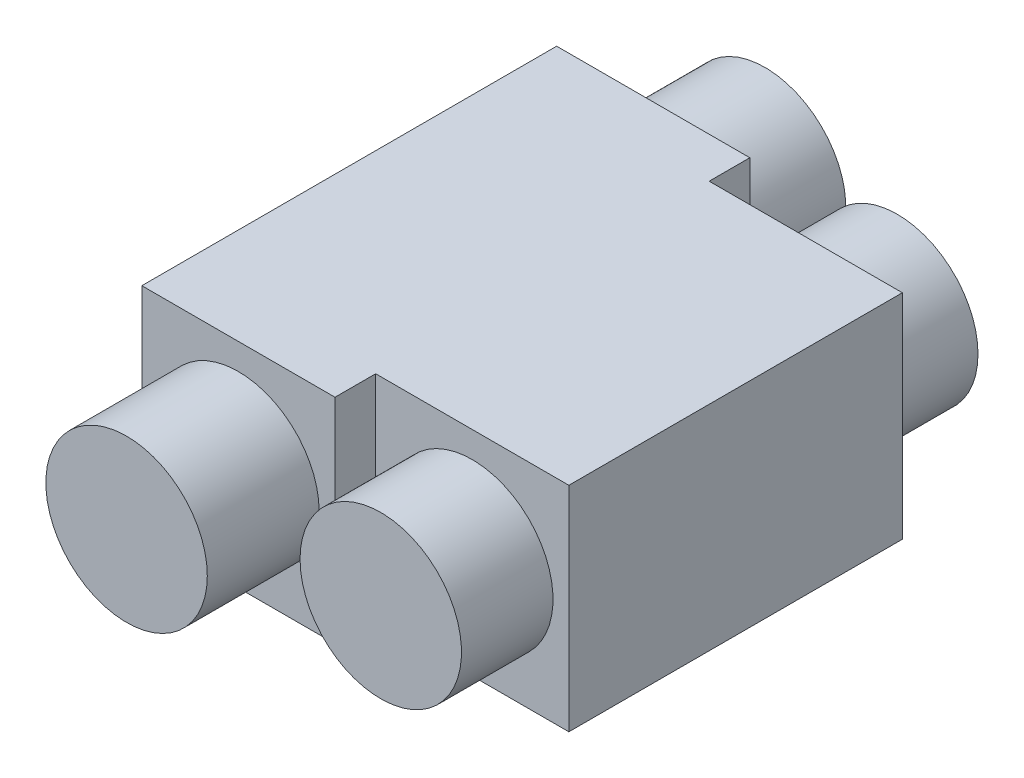
ISO-10303-21;
HEADER;
FILE_DESCRIPTION(('STEP AP214'),'2;1');
FILE_NAME('part.step','',(''),(''),'','','');
FILE_SCHEMA(('AUTOMOTIVE_DESIGN { 1 0 10303 214 1 1 1 1 }'));
ENDSEC;
DATA;
#1=APPLICATION_CONTEXT('core data for automotive mechanical design processes');
#2=APPLICATION_PROTOCOL_DEFINITION('international standard','automotive_design',2000,#1);
#3=PRODUCT_CONTEXT('',#1,'mechanical');
#4=PRODUCT('Part','Part','',(#3));
#5=PRODUCT_RELATED_PRODUCT_CATEGORY('part','',(#4));
#6=PRODUCT_DEFINITION_FORMATION('','',#4);
#7=PRODUCT_DEFINITION_CONTEXT('part definition',#1,'design');
#8=PRODUCT_DEFINITION('design','',#6,#7);
#9=PRODUCT_DEFINITION_SHAPE('','',#8);
#10=(LENGTH_UNIT() NAMED_UNIT(*) SI_UNIT(.MILLI.,.METRE.));
#11=(NAMED_UNIT(*) PLANE_ANGLE_UNIT() SI_UNIT($,.RADIAN.));
#12=(NAMED_UNIT(*) SI_UNIT($,.STERADIAN.) SOLID_ANGLE_UNIT());
#13=UNCERTAINTY_MEASURE_WITH_UNIT(LENGTH_MEASURE(1.E-05),#10,'distance_accuracy_value','');
#14=(GEOMETRIC_REPRESENTATION_CONTEXT(3) GLOBAL_UNCERTAINTY_ASSIGNED_CONTEXT((#13)) GLOBAL_UNIT_ASSIGNED_CONTEXT((#10,
#11,#12)) REPRESENTATION_CONTEXT('',''));
#15=CARTESIAN_POINT('',(0.,0.,0.));
#16=DIRECTION('',(0.,0.,1.));
#17=DIRECTION('',(1.,0.,0.));
#18=AXIS2_PLACEMENT_3D('',#15,#16,#17);
#19=CARTESIAN_POINT('',(-95.,105.,82.));
#20=DIRECTION('',(0.,0.,-1.));
#21=DIRECTION('',(-1.,0.,0.));
#22=AXIS2_PLACEMENT_3D('',#19,#20,#21);
#23=PLANE('',#22);
#24=CARTESIAN_POINT('',(47.5,52.5,82.));
#25=DIRECTION('',(0.,0.,-1.));
#26=DIRECTION('',(-1.,0.,0.));
#27=AXIS2_PLACEMENT_3D('',#24,#25,#26);
#28=CIRCLE('',#27,39.7);
#29=CARTESIAN_POINT('',(7.80000000000002,52.5,82.));
#30=VERTEX_POINT('',#29);
#31=EDGE_CURVE('E44',#30,#30,#28,.F.);
#32=ORIENTED_EDGE('',*,*,#31,.F.);
#33=EDGE_LOOP('',(#32));
#34=FACE_BOUND('',#33,.T.);
#35=DIRECTION('',(0.,1.,0.));
#36=VECTOR('',#35,1.);
#37=CARTESIAN_POINT('',(0.,105.,82.));
#38=LINE('',#37,#36);
#39=CARTESIAN_POINT('',(0.,0.,82.));
#40=VERTEX_POINT('',#39);
#41=CARTESIAN_POINT('',(0.,105.,82.));
#42=VERTEX_POINT('',#41);
#43=EDGE_CURVE('E171',#40,#42,#38,.T.);
#44=ORIENTED_EDGE('',*,*,#43,.F.);
#45=DIRECTION('',(1.,0.,0.));
#46=VECTOR('',#45,1.);
#47=CARTESIAN_POINT('',(-95.,0.,82.));
#48=LINE('',#47,#46);
#49=CARTESIAN_POINT('',(95.,0.,82.));
#50=VERTEX_POINT('',#49);
#51=EDGE_CURVE('E174',#40,#50,#48,.T.);
#52=ORIENTED_EDGE('',*,*,#51,.T.);
#53=DIRECTION('',(0.,-1.,0.));
#54=VECTOR('',#53,1.);
#55=CARTESIAN_POINT('',(95.,105.,82.));
#56=LINE('',#55,#54);
#57=CARTESIAN_POINT('',(95.,105.,82.));
#58=VERTEX_POINT('',#57);
#59=EDGE_CURVE('E197',#58,#50,#56,.T.);
#60=ORIENTED_EDGE('',*,*,#59,.F.);
#61=DIRECTION('',(1.,0.,0.));
#62=VECTOR('',#61,1.);
#63=CARTESIAN_POINT('',(-95.,105.,82.));
#64=LINE('',#63,#62);
#65=EDGE_CURVE('E57',#42,#58,#64,.T.);
#66=ORIENTED_EDGE('',*,*,#65,.F.);
#67=EDGE_LOOP('',(#44,#52,#60,#66));
#68=FACE_BOUND('',#67,.T.);
#69=ADVANCED_FACE('F41',(#34,#68),#23,.F.);
#70=CARTESIAN_POINT('',(-95.,105.,-82.));
#71=DIRECTION('',(0.,0.,-1.));
#72=DIRECTION('',(-1.,0.,0.));
#73=AXIS2_PLACEMENT_3D('',#70,#71,#72);
#74=PLANE('',#73);
#75=CARTESIAN_POINT('',(47.5,52.5,-82.));
#76=DIRECTION('',(0.,0.,-1.));
#77=DIRECTION('',(-1.,0.,0.));
#78=AXIS2_PLACEMENT_3D('',#75,#76,#77);
#79=CIRCLE('',#78,39.7);
#80=CARTESIAN_POINT('',(87.2,52.5,-82.));
#81=VERTEX_POINT('',#80);
#82=EDGE_CURVE('E378',#81,#81,#79,.T.);
#83=ORIENTED_EDGE('',*,*,#82,.F.);
#84=EDGE_LOOP('',(#83));
#85=FACE_BOUND('',#84,.T.);
#86=DIRECTION('',(1.,0.,0.));
#87=VECTOR('',#86,1.);
#88=CARTESIAN_POINT('',(-95.,0.,-82.));
#89=LINE('',#88,#87);
#90=CARTESIAN_POINT('',(0.,0.,-82.));
#91=VERTEX_POINT('',#90);
#92=CARTESIAN_POINT('',(95.,0.,-82.));
#93=VERTEX_POINT('',#92);
#94=EDGE_CURVE('E190',#91,#93,#89,.T.);
#95=ORIENTED_EDGE('',*,*,#94,.F.);
#96=DIRECTION('',(0.,1.,0.));
#97=VECTOR('',#96,1.);
#98=CARTESIAN_POINT('',(0.,105.,-82.));
#99=LINE('',#98,#97);
#100=CARTESIAN_POINT('',(0.,105.,-82.));
#101=VERTEX_POINT('',#100);
#102=EDGE_CURVE('E161',#91,#101,#99,.T.);
#103=ORIENTED_EDGE('',*,*,#102,.T.);
#104=DIRECTION('',(1.,0.,0.));
#105=VECTOR('',#104,1.);
#106=CARTESIAN_POINT('',(-95.,105.,-82.));
#107=LINE('',#106,#105);
#108=CARTESIAN_POINT('',(95.,105.,-82.));
#109=VERTEX_POINT('',#108);
#110=EDGE_CURVE('E120',#101,#109,#107,.T.);
#111=ORIENTED_EDGE('',*,*,#110,.T.);
#112=DIRECTION('',(0.,-1.,0.));
#113=VECTOR('',#112,1.);
#114=CARTESIAN_POINT('',(95.,105.,-82.));
#115=LINE('',#114,#113);
#116=EDGE_CURVE('E119',#109,#93,#115,.T.);
#117=ORIENTED_EDGE('',*,*,#116,.T.);
#118=EDGE_LOOP('',(#95,#103,#111,#117));
#119=FACE_BOUND('',#118,.T.);
#120=ADVANCED_FACE('F213',(#85,#119),#74,.T.);
#121=CARTESIAN_POINT('',(95.,105.,82.));
#122=DIRECTION('',(-1.,0.,0.));
#123=DIRECTION('',(0.,0.,1.));
#124=AXIS2_PLACEMENT_3D('',#121,#122,#123);
#125=PLANE('',#124);
#126=DIRECTION('',(0.,0.,-1.));
#127=VECTOR('',#126,1.);
#128=CARTESIAN_POINT('',(95.,0.,82.));
#129=LINE('',#128,#127);
#130=EDGE_CURVE('E186',#50,#93,#129,.T.);
#131=ORIENTED_EDGE('',*,*,#130,.T.);
#132=ORIENTED_EDGE('',*,*,#116,.F.);
#133=DIRECTION('',(0.,0.,-1.));
#134=VECTOR('',#133,1.);
#135=CARTESIAN_POINT('',(95.,105.,82.));
#136=LINE('',#135,#134);
#137=EDGE_CURVE('E177',#58,#109,#136,.T.);
#138=ORIENTED_EDGE('',*,*,#137,.F.);
#139=ORIENTED_EDGE('',*,*,#59,.T.);
#140=EDGE_LOOP('',(#131,#132,#138,#139));
#141=FACE_BOUND('',#140,.T.);
#142=ADVANCED_FACE('F224',(#141),#125,.F.);
#143=CARTESIAN_POINT('',(-95.,105.,82.));
#144=DIRECTION('',(-1.,0.,0.));
#145=DIRECTION('',(0.,0.,1.));
#146=AXIS2_PLACEMENT_3D('',#143,#144,#145);
#147=PLANE('',#146);
#148=DIRECTION('',(0.,0.,-1.));
#149=VECTOR('',#148,1.);
#150=CARTESIAN_POINT('',(-95.,0.,82.));
#151=LINE('',#150,#149);
#152=CARTESIAN_POINT('',(-95.,0.,102.));
#153=VERTEX_POINT('',#152);
#154=CARTESIAN_POINT('',(-95.,0.,-102.));
#155=VERTEX_POINT('',#154);
#156=EDGE_CURVE('E178',#153,#155,#151,.T.);
#157=ORIENTED_EDGE('',*,*,#156,.F.);
#158=DIRECTION('',(0.,-1.,0.));
#159=VECTOR('',#158,1.);
#160=CARTESIAN_POINT('',(-95.,105.,102.));
#161=LINE('',#160,#159);
#162=CARTESIAN_POINT('',(-95.,105.,102.));
#163=VERTEX_POINT('',#162);
#164=EDGE_CURVE('E114',#163,#153,#161,.T.);
#165=ORIENTED_EDGE('',*,*,#164,.F.);
#166=DIRECTION('',(0.,0.,-1.));
#167=VECTOR('',#166,1.);
#168=CARTESIAN_POINT('',(-95.,105.,82.));
#169=LINE('',#168,#167);
#170=CARTESIAN_POINT('',(-95.,105.,-102.));
#171=VERTEX_POINT('',#170);
#172=EDGE_CURVE('E108',#163,#171,#169,.T.);
#173=ORIENTED_EDGE('',*,*,#172,.T.);
#174=DIRECTION('',(0.,-1.,0.));
#175=VECTOR('',#174,1.);
#176=CARTESIAN_POINT('',(-95.,105.,-102.));
#177=LINE('',#176,#175);
#178=EDGE_CURVE('E111',#171,#155,#177,.T.);
#179=ORIENTED_EDGE('',*,*,#178,.T.);
#180=EDGE_LOOP('',(#157,#165,#173,#179));
#181=FACE_BOUND('',#180,.T.);
#182=ADVANCED_FACE('F110',(#181),#147,.T.);
#183=CARTESIAN_POINT('',(0.,105.,0.));
#184=DIRECTION('',(0.,1.,0.));
#185=DIRECTION('',(0.,0.,1.));
#186=AXIS2_PLACEMENT_3D('',#183,#184,#185);
#187=PLANE('',#186);
#188=ORIENTED_EDGE('',*,*,#172,.F.);
#189=DIRECTION('',(1.,0.,0.));
#190=VECTOR('',#189,1.);
#191=CARTESIAN_POINT('',(-95.,105.,102.));
#192=LINE('',#191,#190);
#193=CARTESIAN_POINT('',(0.,105.,102.));
#194=VERTEX_POINT('',#193);
#195=EDGE_CURVE('E130',#163,#194,#192,.T.);
#196=ORIENTED_EDGE('',*,*,#195,.T.);
#197=DIRECTION('',(0.,0.,-1.));
#198=VECTOR('',#197,1.);
#199=CARTESIAN_POINT('',(0.,105.,102.));
#200=LINE('',#199,#198);
#201=EDGE_CURVE('E141',#194,#42,#200,.T.);
#202=ORIENTED_EDGE('',*,*,#201,.T.);
#203=ORIENTED_EDGE('',*,*,#65,.T.);
#204=ORIENTED_EDGE('',*,*,#137,.T.);
#205=ORIENTED_EDGE('',*,*,#110,.F.);
#206=CARTESIAN_POINT('',(0.,105.,-102.));
#207=VERTEX_POINT('',#206);
#208=EDGE_CURVE('E134',#101,#207,#200,.T.);
#209=ORIENTED_EDGE('',*,*,#208,.T.);
#210=DIRECTION('',(1.,0.,0.));
#211=VECTOR('',#210,1.);
#212=CARTESIAN_POINT('',(-95.,105.,-102.));
#213=LINE('',#212,#211);
#214=EDGE_CURVE('E126',#171,#207,#213,.T.);
#215=ORIENTED_EDGE('',*,*,#214,.F.);
#216=EDGE_LOOP('',(#188,#196,#202,#203,#204,#205,#209,#215));
#217=FACE_BOUND('',#216,.T.);
#218=ADVANCED_FACE('F132',(#217),#187,.T.);
#219=CARTESIAN_POINT('',(0.,0.,0.));
#220=DIRECTION('',(0.,1.,0.));
#221=DIRECTION('',(0.,0.,1.));
#222=AXIS2_PLACEMENT_3D('',#219,#220,#221);
#223=PLANE('',#222);
#224=ORIENTED_EDGE('',*,*,#156,.T.);
#225=DIRECTION('',(1.,0.,0.));
#226=VECTOR('',#225,1.);
#227=CARTESIAN_POINT('',(-95.,0.,-102.));
#228=LINE('',#227,#226);
#229=CARTESIAN_POINT('',(0.,0.,-102.));
#230=VERTEX_POINT('',#229);
#231=EDGE_CURVE('E127',#155,#230,#228,.T.);
#232=ORIENTED_EDGE('',*,*,#231,.T.);
#233=DIRECTION('',(0.,0.,-1.));
#234=VECTOR('',#233,1.);
#235=CARTESIAN_POINT('',(0.,0.,102.));
#236=LINE('',#235,#234);
#237=EDGE_CURVE('E65',#91,#230,#236,.T.);
#238=ORIENTED_EDGE('',*,*,#237,.F.);
#239=ORIENTED_EDGE('',*,*,#94,.T.);
#240=ORIENTED_EDGE('',*,*,#130,.F.);
#241=ORIENTED_EDGE('',*,*,#51,.F.);
#242=CARTESIAN_POINT('',(0.,0.,102.));
#243=VERTEX_POINT('',#242);
#244=EDGE_CURVE('E143',#243,#40,#236,.T.);
#245=ORIENTED_EDGE('',*,*,#244,.F.);
#246=DIRECTION('',(1.,0.,0.));
#247=VECTOR('',#246,1.);
#248=CARTESIAN_POINT('',(-95.,0.,102.));
#249=LINE('',#248,#247);
#250=EDGE_CURVE('E137',#153,#243,#249,.T.);
#251=ORIENTED_EDGE('',*,*,#250,.F.);
#252=EDGE_LOOP('',(#224,#232,#238,#239,#240,#241,#245,#251));
#253=FACE_BOUND('',#252,.T.);
#254=ADVANCED_FACE('F221',(#253),#223,.F.);
#255=CARTESIAN_POINT('',(-95.,105.,-102.));
#256=DIRECTION('',(0.,0.,-1.));
#257=DIRECTION('',(-1.,0.,0.));
#258=AXIS2_PLACEMENT_3D('',#255,#256,#257);
#259=PLANE('',#258);
#260=CARTESIAN_POINT('',(-47.5,52.5,-102.));
#261=DIRECTION('',(0.,0.,-1.));
#262=DIRECTION('',(-1.,0.,0.));
#263=AXIS2_PLACEMENT_3D('',#260,#261,#262);
#264=CIRCLE('',#263,39.7);
#265=CARTESIAN_POINT('',(-87.2,52.5,-102.));
#266=VERTEX_POINT('',#265);
#267=EDGE_CURVE('E11',#266,#266,#264,.T.);
#268=ORIENTED_EDGE('',*,*,#267,.F.);
#269=EDGE_LOOP('',(#268));
#270=FACE_BOUND('',#269,.T.);
#271=ORIENTED_EDGE('',*,*,#231,.F.);
#272=ORIENTED_EDGE('',*,*,#178,.F.);
#273=ORIENTED_EDGE('',*,*,#214,.T.);
#274=DIRECTION('',(0.,-1.,0.));
#275=VECTOR('',#274,1.);
#276=CARTESIAN_POINT('',(0.,105.,-102.));
#277=LINE('',#276,#275);
#278=EDGE_CURVE('E129',#207,#230,#277,.T.);
#279=ORIENTED_EDGE('',*,*,#278,.T.);
#280=EDGE_LOOP('',(#271,#272,#273,#279));
#281=FACE_BOUND('',#280,.T.);
#282=ADVANCED_FACE('F124',(#270,#281),#259,.T.);
#283=CARTESIAN_POINT('',(0.,105.,102.));
#284=DIRECTION('',(-1.,0.,0.));
#285=DIRECTION('',(0.,0.,1.));
#286=AXIS2_PLACEMENT_3D('',#283,#284,#285);
#287=PLANE('',#286);
#288=ORIENTED_EDGE('',*,*,#102,.F.);
#289=ORIENTED_EDGE('',*,*,#237,.T.);
#290=ORIENTED_EDGE('',*,*,#278,.F.);
#291=ORIENTED_EDGE('',*,*,#208,.F.);
#292=EDGE_LOOP('',(#288,#289,#290,#291));
#293=FACE_BOUND('',#292,.T.);
#294=ADVANCED_FACE('F239',(#293),#287,.F.);
#295=ORIENTED_EDGE('',*,*,#244,.T.);
#296=ORIENTED_EDGE('',*,*,#43,.T.);
#297=ORIENTED_EDGE('',*,*,#201,.F.);
#298=DIRECTION('',(0.,-1.,0.));
#299=VECTOR('',#298,1.);
#300=CARTESIAN_POINT('',(0.,105.,102.));
#301=LINE('',#300,#299);
#302=EDGE_CURVE('E162',#194,#243,#301,.T.);
#303=ORIENTED_EDGE('',*,*,#302,.T.);
#304=EDGE_LOOP('',(#295,#296,#297,#303));
#305=FACE_BOUND('',#304,.T.);
#306=ADVANCED_FACE('F218',(#305),#287,.F.);
#307=CARTESIAN_POINT('',(-95.,105.,102.));
#308=DIRECTION('',(0.,0.,-1.));
#309=DIRECTION('',(-1.,0.,0.));
#310=AXIS2_PLACEMENT_3D('',#307,#308,#309);
#311=PLANE('',#310);
#312=CARTESIAN_POINT('',(-47.5,52.5,102.));
#313=DIRECTION('',(0.,0.,1.));
#314=DIRECTION('',(1.,0.,0.));
#315=AXIS2_PLACEMENT_3D('',#312,#313,#314);
#316=CIRCLE('',#315,39.7);
#317=CARTESIAN_POINT('',(-7.79999999999997,52.5,102.));
#318=VERTEX_POINT('',#317);
#319=EDGE_CURVE('E146',#318,#318,#316,.T.);
#320=ORIENTED_EDGE('',*,*,#319,.F.);
#321=EDGE_LOOP('',(#320));
#322=FACE_BOUND('',#321,.T.);
#323=ORIENTED_EDGE('',*,*,#250,.T.);
#324=ORIENTED_EDGE('',*,*,#302,.F.);
#325=ORIENTED_EDGE('',*,*,#195,.F.);
#326=ORIENTED_EDGE('',*,*,#164,.T.);
#327=EDGE_LOOP('',(#323,#324,#325,#326));
#328=FACE_BOUND('',#327,.T.);
#329=ADVANCED_FACE('F227',(#322,#328),#311,.F.);
#330=CARTESIAN_POINT('',(-47.5,52.5,157.));
#331=DIRECTION('',(0.,0.,-1.));
#332=DIRECTION('',(-1.,0.,0.));
#333=AXIS2_PLACEMENT_3D('',#330,#331,#332);
#334=CYLINDRICAL_SURFACE('',#333,39.7);
#335=CARTESIAN_POINT('',(-47.5,52.5,157.));
#336=DIRECTION('',(0.,0.,1.));
#337=DIRECTION('',(1.,0.,0.));
#338=AXIS2_PLACEMENT_3D('',#335,#336,#337);
#339=CIRCLE('',#338,39.7);
#340=CARTESIAN_POINT('',(-7.79999999999997,52.5,157.));
#341=VERTEX_POINT('',#340);
#342=EDGE_CURVE('E155',#341,#341,#339,.T.);
#343=ORIENTED_EDGE('',*,*,#342,.F.);
#344=EDGE_LOOP('',(#343));
#345=FACE_BOUND('',#344,.T.);
#346=ORIENTED_EDGE('',*,*,#319,.T.);
#347=EDGE_LOOP('',(#346));
#348=FACE_BOUND('',#347,.T.);
#349=ADVANCED_FACE('F229',(#345,#348),#334,.T.);
#350=CARTESIAN_POINT('',(-47.5,52.5,157.));
#351=DIRECTION('',(0.,0.,1.));
#352=DIRECTION('',(1.,0.,0.));
#353=AXIS2_PLACEMENT_3D('',#350,#351,#352);
#354=PLANE('',#353);
#355=ORIENTED_EDGE('',*,*,#342,.T.);
#356=EDGE_LOOP('',(#355));
#357=FACE_BOUND('',#356,.T.);
#358=ADVANCED_FACE('F236',(#357),#354,.T.);
#359=CARTESIAN_POINT('',(47.5,52.5,127.));
#360=DIRECTION('',(0.,0.,-1.));
#361=DIRECTION('',(-1.,0.,0.));
#362=AXIS2_PLACEMENT_3D('',#359,#360,#361);
#363=CYLINDRICAL_SURFACE('',#362,39.7);
#364=CARTESIAN_POINT('',(47.5,52.5,127.));
#365=DIRECTION('',(0.,0.,1.));
#366=DIRECTION('',(1.,0.,0.));
#367=AXIS2_PLACEMENT_3D('',#364,#365,#366);
#368=CIRCLE('',#367,39.7);
#369=CARTESIAN_POINT('',(7.80000000000002,52.5,127.));
#370=VERTEX_POINT('',#369);
#371=EDGE_CURVE('E383',#370,#370,#368,.T.);
#372=CARTESIAN_POINT('',(7.80000000000002,52.5,127.));
#373=CARTESIAN_POINT('',(7.80000000000002,52.5,126.53125));
#374=CARTESIAN_POINT('',(7.80000000000002,52.5,126.0625));
#375=CARTESIAN_POINT('',(7.80000000000002,52.5,125.125));
#376=CARTESIAN_POINT('',(7.80000000000002,52.5,124.65625));
#377=CARTESIAN_POINT('',(7.80000000000002,52.5,123.71875));
#378=CARTESIAN_POINT('',(7.80000000000002,52.5,123.25));
#379=CARTESIAN_POINT('',(7.80000000000002,52.5,122.3125));
#380=CARTESIAN_POINT('',(7.80000000000002,52.5,121.84375));
#381=CARTESIAN_POINT('',(7.80000000000002,52.5,120.90625));
#382=CARTESIAN_POINT('',(7.80000000000002,52.5,120.4375));
#383=CARTESIAN_POINT('',(7.80000000000002,52.5,119.5));
#384=CARTESIAN_POINT('',(7.80000000000002,52.5,119.03125));
#385=CARTESIAN_POINT('',(7.80000000000002,52.5,118.09375));
#386=CARTESIAN_POINT('',(7.80000000000002,52.5,117.625));
#387=CARTESIAN_POINT('',(7.80000000000002,52.5,116.6875));
#388=CARTESIAN_POINT('',(7.80000000000002,52.5,116.21875));
#389=CARTESIAN_POINT('',(7.80000000000002,52.5,115.28125));
#390=CARTESIAN_POINT('',(7.80000000000002,52.5,114.8125));
#391=CARTESIAN_POINT('',(7.80000000000002,52.5,113.875));
#392=CARTESIAN_POINT('',(7.80000000000002,52.5,113.40625));
#393=CARTESIAN_POINT('',(7.80000000000002,52.5,112.46875));
#394=CARTESIAN_POINT('',(7.80000000000002,52.5,112.));
#395=CARTESIAN_POINT('',(7.80000000000002,52.5,111.0625));
#396=CARTESIAN_POINT('',(7.80000000000002,52.5,110.59375));
#397=CARTESIAN_POINT('',(7.80000000000002,52.5,109.65625));
#398=CARTESIAN_POINT('',(7.80000000000002,52.5,109.1875));
#399=CARTESIAN_POINT('',(7.80000000000002,52.5,108.25));
#400=CARTESIAN_POINT('',(7.80000000000002,52.5,107.78125));
#401=CARTESIAN_POINT('',(7.80000000000002,52.5,106.84375));
#402=CARTESIAN_POINT('',(7.80000000000002,52.5,106.375));
#403=CARTESIAN_POINT('',(7.80000000000002,52.5,105.4375));
#404=CARTESIAN_POINT('',(7.80000000000002,52.5,104.96875));
#405=CARTESIAN_POINT('',(7.80000000000002,52.5,104.03125));
#406=CARTESIAN_POINT('',(7.80000000000002,52.5,103.5625));
#407=CARTESIAN_POINT('',(7.80000000000002,52.5,102.625));
#408=CARTESIAN_POINT('',(7.80000000000002,52.5,102.15625));
#409=CARTESIAN_POINT('',(7.80000000000002,52.5,101.21875));
#410=CARTESIAN_POINT('',(7.80000000000002,52.5,100.75));
#411=CARTESIAN_POINT('',(7.80000000000002,52.5,99.8125));
#412=CARTESIAN_POINT('',(7.80000000000002,52.5,99.34375));
#413=CARTESIAN_POINT('',(7.80000000000002,52.5,98.40625));
#414=CARTESIAN_POINT('',(7.80000000000002,52.5,97.9375));
#415=CARTESIAN_POINT('',(7.80000000000002,52.5,97.));
#416=CARTESIAN_POINT('',(7.80000000000002,52.5,96.53125));
#417=CARTESIAN_POINT('',(7.80000000000002,52.5,95.59375));
#418=CARTESIAN_POINT('',(7.80000000000002,52.5,95.125));
#419=CARTESIAN_POINT('',(7.80000000000002,52.5,94.1875));
#420=CARTESIAN_POINT('',(7.80000000000002,52.5,93.71875));
#421=CARTESIAN_POINT('',(7.80000000000002,52.5,92.78125));
#422=CARTESIAN_POINT('',(7.80000000000002,52.5,92.3125));
#423=CARTESIAN_POINT('',(7.80000000000002,52.5,91.375));
#424=CARTESIAN_POINT('',(7.80000000000002,52.5,90.90625));
#425=CARTESIAN_POINT('',(7.80000000000002,52.5,89.96875));
#426=CARTESIAN_POINT('',(7.80000000000002,52.5,89.5));
#427=CARTESIAN_POINT('',(7.80000000000002,52.5,88.5625));
#428=CARTESIAN_POINT('',(7.80000000000002,52.5,88.09375));
#429=CARTESIAN_POINT('',(7.80000000000002,52.5,87.15625));
#430=CARTESIAN_POINT('',(7.80000000000002,52.5,86.6875));
#431=CARTESIAN_POINT('',(7.80000000000002,52.5,85.75));
#432=CARTESIAN_POINT('',(7.80000000000002,52.5,85.28125));
#433=CARTESIAN_POINT('',(7.80000000000002,52.5,84.34375));
#434=CARTESIAN_POINT('',(7.80000000000002,52.5,83.875));
#435=CARTESIAN_POINT('',(7.80000000000002,52.5,82.9375));
#436=CARTESIAN_POINT('',(7.80000000000002,52.5,82.46875));
#437=CARTESIAN_POINT('',(7.80000000000002,52.5,82.));
#438=B_SPLINE_CURVE_WITH_KNOTS('',3,(#372,#373,#374,#375,#376,#377,#378,#379,#380,#381,#382,
#383,#384,#385,#386,#387,#388,#389,#390,#391,#392,#393,#394,#395,#396,#397,#398,#399,#400,#401,
#402,#403,#404,#405,#406,#407,#408,#409,#410,#411,#412,#413,#414,#415,#416,#417,#418,#419,#420,
#421,#422,#423,#424,#425,#426,#427,#428,#429,#430,#431,#432,#433,#434,#435,#436,#437),
.UNSPECIFIED.,.F.,.F.,(4,2,2,2,2,2,2,2,2,2,2,2,2,2,2,2,2,2,2,2,2,2,2,2,2,2,2,2,2,2,2,2,4),(0.,
1.40625,2.81249999999998,4.21874999999998,5.62499999999998,7.03124999999999,8.43749999999999,
9.84374999999998,11.25,12.65625,14.0625,15.46875,16.875,18.28125,19.6875,21.09375,22.5,23.90625,
25.3125,26.71875,28.125,29.53125,30.9375,32.34375,33.75,35.15625,36.5625,37.96875,39.375,
40.78125,42.1875,43.59375,45.),.UNSPECIFIED.);
#439=EDGE_CURVE('BSEAM210',#370,#30,#438,.T.);
#440=ORIENTED_EDGE('',*,*,#371,.F.);
#441=ORIENTED_EDGE('',*,*,#31,.T.);
#442=ORIENTED_EDGE('',*,*,#439,.T.);
#443=ORIENTED_EDGE('',*,*,#439,.F.);
#444=EDGE_LOOP('',(#440,#442,#441,#443));
#445=FACE_BOUND('',#444,.T.);
#446=ADVANCED_FACE('F210',(#445),#363,.T.);
#447=CARTESIAN_POINT('',(47.5,52.5,127.));
#448=DIRECTION('',(0.,0.,1.));
#449=DIRECTION('',(1.,0.,0.));
#450=AXIS2_PLACEMENT_3D('',#447,#448,#449);
#451=PLANE('',#450);
#452=ORIENTED_EDGE('',*,*,#371,.T.);
#453=EDGE_LOOP('',(#452));
#454=FACE_BOUND('',#453,.T.);
#455=ADVANCED_FACE('F320',(#454),#451,.T.);
#456=CARTESIAN_POINT('',(-47.5,52.5,-157.));
#457=DIRECTION('',(0.,0.,1.));
#458=DIRECTION('',(1.,0.,0.));
#459=AXIS2_PLACEMENT_3D('',#456,#457,#458);
#460=CYLINDRICAL_SURFACE('',#459,39.7);
#461=CARTESIAN_POINT('',(-47.5,52.5,-157.));
#462=DIRECTION('',(0.,0.,-1.));
#463=DIRECTION('',(-1.,0.,0.));
#464=AXIS2_PLACEMENT_3D('',#461,#462,#463);
#465=CIRCLE('',#464,39.7);
#466=CARTESIAN_POINT('',(-87.2,52.5,-157.));
#467=VERTEX_POINT('',#466);
#468=EDGE_CURVE('E377',#467,#467,#465,.T.);
#469=ORIENTED_EDGE('',*,*,#468,.F.);
#470=EDGE_LOOP('',(#469));
#471=FACE_BOUND('',#470,.T.);
#472=ORIENTED_EDGE('',*,*,#267,.T.);
#473=EDGE_LOOP('',(#472));
#474=FACE_BOUND('',#473,.T.);
#475=ADVANCED_FACE('F329',(#471,#474),#460,.T.);
#476=CARTESIAN_POINT('',(-47.5,52.5,-157.));
#477=DIRECTION('',(0.,0.,-1.));
#478=DIRECTION('',(-1.,0.,0.));
#479=AXIS2_PLACEMENT_3D('',#476,#477,#478);
#480=PLANE('',#479);
#481=ORIENTED_EDGE('',*,*,#468,.T.);
#482=EDGE_LOOP('',(#481));
#483=FACE_BOUND('',#482,.T.);
#484=ADVANCED_FACE('F339',(#483),#480,.T.);
#485=CARTESIAN_POINT('',(47.5,52.5,-127.));
#486=DIRECTION('',(0.,0.,1.));
#487=DIRECTION('',(1.,0.,0.));
#488=AXIS2_PLACEMENT_3D('',#485,#486,#487);
#489=CYLINDRICAL_SURFACE('',#488,39.7);
#490=CARTESIAN_POINT('',(47.5,52.5,-127.));
#491=DIRECTION('',(0.,0.,-1.));
#492=DIRECTION('',(-1.,0.,0.));
#493=AXIS2_PLACEMENT_3D('',#490,#491,#492);
#494=CIRCLE('',#493,39.7);
#495=CARTESIAN_POINT('',(87.2,52.5,-127.));
#496=VERTEX_POINT('',#495);
#497=EDGE_CURVE('E375',#496,#496,#494,.T.);
#498=CARTESIAN_POINT('',(87.2,52.5,-127.));
#499=CARTESIAN_POINT('',(87.2,52.5,-126.53125));
#500=CARTESIAN_POINT('',(87.2,52.5,-126.0625));
#501=CARTESIAN_POINT('',(87.2,52.5,-125.125));
#502=CARTESIAN_POINT('',(87.2,52.5,-124.65625));
#503=CARTESIAN_POINT('',(87.2,52.5,-123.71875));
#504=CARTESIAN_POINT('',(87.2,52.5,-123.25));
#505=CARTESIAN_POINT('',(87.2,52.5,-122.3125));
#506=CARTESIAN_POINT('',(87.2,52.5,-121.84375));
#507=CARTESIAN_POINT('',(87.2,52.5,-120.90625));
#508=CARTESIAN_POINT('',(87.2,52.5,-120.4375));
#509=CARTESIAN_POINT('',(87.2,52.5,-119.5));
#510=CARTESIAN_POINT('',(87.2,52.5,-119.03125));
#511=CARTESIAN_POINT('',(87.2,52.5,-118.09375));
#512=CARTESIAN_POINT('',(87.2,52.5,-117.625));
#513=CARTESIAN_POINT('',(87.2,52.5,-116.6875));
#514=CARTESIAN_POINT('',(87.2,52.5,-116.21875));
#515=CARTESIAN_POINT('',(87.2,52.5,-115.28125));
#516=CARTESIAN_POINT('',(87.2,52.5,-114.8125));
#517=CARTESIAN_POINT('',(87.2,52.5,-113.875));
#518=CARTESIAN_POINT('',(87.2,52.5,-113.40625));
#519=CARTESIAN_POINT('',(87.2,52.5,-112.46875));
#520=CARTESIAN_POINT('',(87.2,52.5,-112.));
#521=CARTESIAN_POINT('',(87.2,52.5,-111.0625));
#522=CARTESIAN_POINT('',(87.2,52.5,-110.59375));
#523=CARTESIAN_POINT('',(87.2,52.5,-109.65625));
#524=CARTESIAN_POINT('',(87.2,52.5,-109.1875));
#525=CARTESIAN_POINT('',(87.2,52.5,-108.25));
#526=CARTESIAN_POINT('',(87.2,52.5,-107.78125));
#527=CARTESIAN_POINT('',(87.2,52.5,-106.84375));
#528=CARTESIAN_POINT('',(87.2,52.5,-106.375));
#529=CARTESIAN_POINT('',(87.2,52.5,-105.4375));
#530=CARTESIAN_POINT('',(87.2,52.5,-104.96875));
#531=CARTESIAN_POINT('',(87.2,52.5,-104.03125));
#532=CARTESIAN_POINT('',(87.2,52.5,-103.5625));
#533=CARTESIAN_POINT('',(87.2,52.5,-102.625));
#534=CARTESIAN_POINT('',(87.2,52.5,-102.15625));
#535=CARTESIAN_POINT('',(87.2,52.5,-101.21875));
#536=CARTESIAN_POINT('',(87.2,52.5,-100.75));
#537=CARTESIAN_POINT('',(87.2,52.5,-99.8125));
#538=CARTESIAN_POINT('',(87.2,52.5,-99.34375));
#539=CARTESIAN_POINT('',(87.2,52.5,-98.40625));
#540=CARTESIAN_POINT('',(87.2,52.5,-97.9375));
#541=CARTESIAN_POINT('',(87.2,52.5,-97.));
#542=CARTESIAN_POINT('',(87.2,52.5,-96.53125));
#543=CARTESIAN_POINT('',(87.2,52.5,-95.59375));
#544=CARTESIAN_POINT('',(87.2,52.5,-95.125));
#545=CARTESIAN_POINT('',(87.2,52.5,-94.1875));
#546=CARTESIAN_POINT('',(87.2,52.5,-93.71875));
#547=CARTESIAN_POINT('',(87.2,52.5,-92.78125));
#548=CARTESIAN_POINT('',(87.2,52.5,-92.3125));
#549=CARTESIAN_POINT('',(87.2,52.5,-91.375));
#550=CARTESIAN_POINT('',(87.2,52.5,-90.90625));
#551=CARTESIAN_POINT('',(87.2,52.5,-89.96875));
#552=CARTESIAN_POINT('',(87.2,52.5,-89.5));
#553=CARTESIAN_POINT('',(87.2,52.5,-88.5625));
#554=CARTESIAN_POINT('',(87.2,52.5,-88.09375));
#555=CARTESIAN_POINT('',(87.2,52.5,-87.15625));
#556=CARTESIAN_POINT('',(87.2,52.5,-86.6875));
#557=CARTESIAN_POINT('',(87.2,52.5,-85.75));
#558=CARTESIAN_POINT('',(87.2,52.5,-85.28125));
#559=CARTESIAN_POINT('',(87.2,52.5,-84.34375));
#560=CARTESIAN_POINT('',(87.2,52.5,-83.875));
#561=CARTESIAN_POINT('',(87.2,52.5,-82.9375));
#562=CARTESIAN_POINT('',(87.2,52.5,-82.46875));
#563=CARTESIAN_POINT('',(87.2,52.5,-82.));
#564=B_SPLINE_CURVE_WITH_KNOTS('',3,(#498,#499,#500,#501,#502,#503,#504,#505,#506,#507,#508,
#509,#510,#511,#512,#513,#514,#515,#516,#517,#518,#519,#520,#521,#522,#523,#524,#525,#526,#527,
#528,#529,#530,#531,#532,#533,#534,#535,#536,#537,#538,#539,#540,#541,#542,#543,#544,#545,#546,
#547,#548,#549,#550,#551,#552,#553,#554,#555,#556,#557,#558,#559,#560,#561,#562,#563),
.UNSPECIFIED.,.F.,.F.,(4,2,2,2,2,2,2,2,2,2,2,2,2,2,2,2,2,2,2,2,2,2,2,2,2,2,2,2,2,2,2,2,4),(0.,
1.40625,2.81249999999998,4.21874999999998,5.62499999999999,7.03124999999999,8.43749999999999,
9.84374999999998,11.25,12.65625,14.0625,15.46875,16.875,18.28125,19.6875,21.09375,22.5,23.90625,
25.3125,26.71875,28.125,29.53125,30.9375,32.34375,33.75,35.15625,36.5625,37.96875,39.375,
40.78125,42.1875,43.59375,45.),.UNSPECIFIED.);
#565=EDGE_CURVE('BSEAM346',#496,#81,#564,.T.);
#566=ORIENTED_EDGE('',*,*,#497,.F.);
#567=ORIENTED_EDGE('',*,*,#82,.T.);
#568=ORIENTED_EDGE('',*,*,#565,.T.);
#569=ORIENTED_EDGE('',*,*,#565,.F.);
#570=EDGE_LOOP('',(#566,#568,#567,#569));
#571=FACE_BOUND('',#570,.T.);
#572=ADVANCED_FACE('F346',(#571),#489,.T.);
#573=CARTESIAN_POINT('',(47.5,52.5,-127.));
#574=DIRECTION('',(0.,0.,-1.));
#575=DIRECTION('',(-1.,0.,0.));
#576=AXIS2_PLACEMENT_3D('',#573,#574,#575);
#577=PLANE('',#576);
#578=ORIENTED_EDGE('',*,*,#497,.T.);
#579=EDGE_LOOP('',(#578));
#580=FACE_BOUND('',#579,.T.);
#581=ADVANCED_FACE('F354',(#580),#577,.T.);
#582=CLOSED_SHELL('',(#69,#120,#142,#182,#218,#254,#282,#294,#306,#329,#349,#358,#446,#455,#475,
#484,#572,#581));
#583=MANIFOLD_SOLID_BREP('B2',#582);
#584=ADVANCED_BREP_SHAPE_REPRESENTATION('',(#18,#583),#14);
#585=SHAPE_DEFINITION_REPRESENTATION(#9,#584);
ENDSEC;
END-ISO-10303-21;
